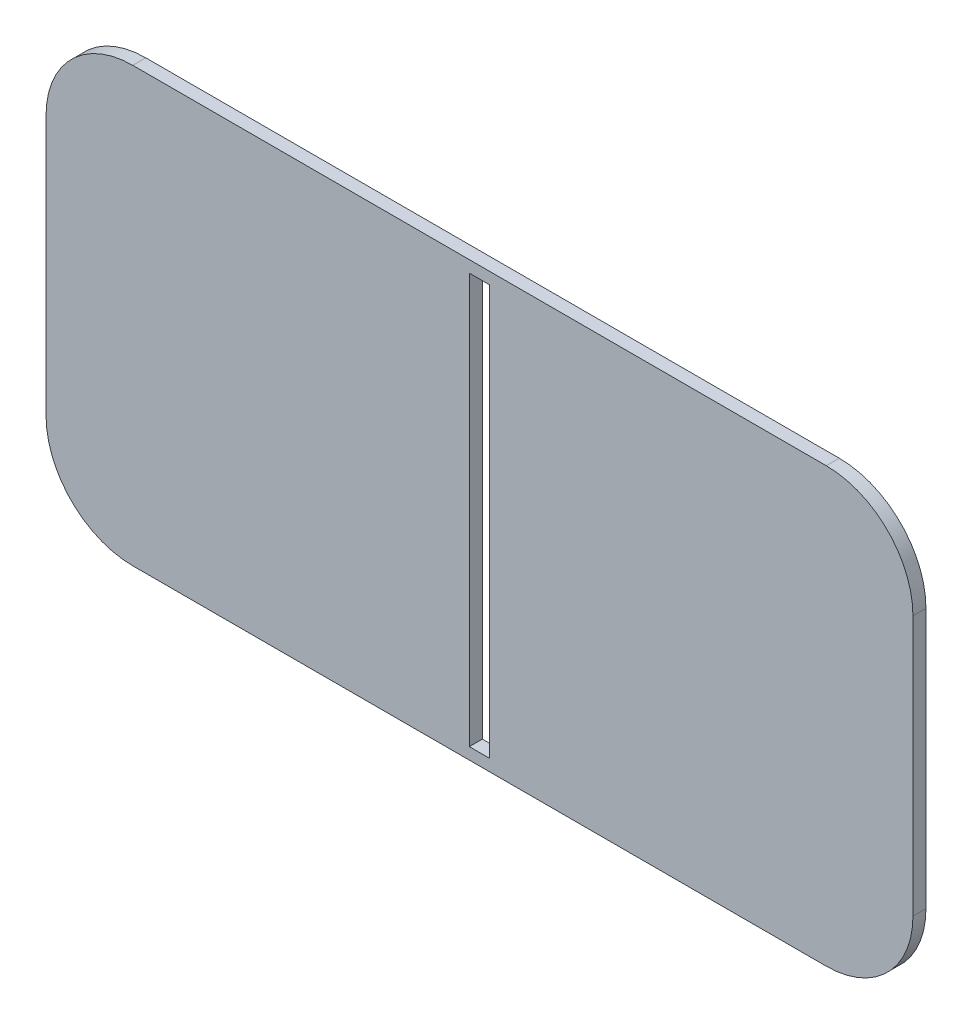
ISO-10303-21;
HEADER;
FILE_DESCRIPTION(('STEP AP214'),'2;1');
FILE_NAME('part.step','',(''),(''),'','','');
FILE_SCHEMA(('AUTOMOTIVE_DESIGN { 1 0 10303 214 1 1 1 1 }'));
ENDSEC;
DATA;
#1=APPLICATION_CONTEXT('core data for automotive mechanical design processes');
#2=APPLICATION_PROTOCOL_DEFINITION('international standard','automotive_design',2000,#1);
#3=PRODUCT_CONTEXT('',#1,'mechanical');
#4=PRODUCT('Part','Part','',(#3));
#5=PRODUCT_RELATED_PRODUCT_CATEGORY('part','',(#4));
#6=PRODUCT_DEFINITION_FORMATION('','',#4);
#7=PRODUCT_DEFINITION_CONTEXT('part definition',#1,'design');
#8=PRODUCT_DEFINITION('design','',#6,#7);
#9=PRODUCT_DEFINITION_SHAPE('','',#8);
#10=(LENGTH_UNIT() NAMED_UNIT(*) SI_UNIT(.MILLI.,.METRE.));
#11=(NAMED_UNIT(*) PLANE_ANGLE_UNIT() SI_UNIT($,.RADIAN.));
#12=(NAMED_UNIT(*) SI_UNIT($,.STERADIAN.) SOLID_ANGLE_UNIT());
#13=UNCERTAINTY_MEASURE_WITH_UNIT(LENGTH_MEASURE(1.E-05),#10,'distance_accuracy_value','');
#14=(GEOMETRIC_REPRESENTATION_CONTEXT(3) GLOBAL_UNCERTAINTY_ASSIGNED_CONTEXT((#13)) GLOBAL_UNIT_ASSIGNED_CONTEXT((#10,
#11,#12)) REPRESENTATION_CONTEXT('',''));
#15=CARTESIAN_POINT('',(0.,0.,0.));
#16=DIRECTION('',(0.,0.,1.));
#17=DIRECTION('',(1.,0.,0.));
#18=AXIS2_PLACEMENT_3D('',#15,#16,#17);
#19=CARTESIAN_POINT('',(98.5837081997804,0.,3.));
#20=DIRECTION('',(1.,0.,0.));
#21=DIRECTION('',(0.,0.,-1.));
#22=AXIS2_PLACEMENT_3D('',#19,#20,#21);
#23=PLANE('',#22);
#24=DIRECTION('',(0.,-1.,0.));
#25=VECTOR('',#24,1.);
#26=CARTESIAN_POINT('',(98.5837081997804,0.,0.));
#27=LINE('',#26,#25);
#28=CARTESIAN_POINT('',(98.5837081997804,-0.678529713852669,0.));
#29=VERTEX_POINT('',#28);
#30=CARTESIAN_POINT('',(98.5837081997804,-95.2819333125222,0.));
#31=VERTEX_POINT('',#30);
#32=EDGE_CURVE('E179',#29,#31,#27,.T.);
#33=ORIENTED_EDGE('',*,*,#32,.T.);
#34=DIRECTION('',(0.,0.,-1.));
#35=VECTOR('',#34,1.);
#36=CARTESIAN_POINT('',(98.5837081997804,-95.2819333125222,3.));
#37=LINE('',#36,#35);
#38=CARTESIAN_POINT('',(98.5837081997804,-95.2819333125222,3.));
#39=VERTEX_POINT('',#38);
#40=EDGE_CURVE('E11',#39,#31,#37,.T.);
#41=ORIENTED_EDGE('',*,*,#40,.F.);
#42=DIRECTION('',(0.,-1.,0.));
#43=VECTOR('',#42,1.);
#44=CARTESIAN_POINT('',(98.5837081997804,0.,3.));
#45=LINE('',#44,#43);
#46=CARTESIAN_POINT('',(98.5837081997804,-0.678529713852669,3.));
#47=VERTEX_POINT('',#46);
#48=EDGE_CURVE('E149',#47,#39,#45,.T.);
#49=ORIENTED_EDGE('',*,*,#48,.F.);
#50=DIRECTION('',(0.,0.,-1.));
#51=VECTOR('',#50,1.);
#52=CARTESIAN_POINT('',(98.5837081997804,-0.678529713852669,3.));
#53=LINE('',#52,#51);
#54=EDGE_CURVE('E187',#47,#29,#53,.T.);
#55=ORIENTED_EDGE('',*,*,#54,.T.);
#56=EDGE_LOOP('',(#33,#41,#49,#55));
#57=FACE_BOUND('',#56,.T.);
#58=ADVANCED_FACE('F39',(#57),#23,.F.);
#59=CARTESIAN_POINT('',(0.,-95.2819333125222,3.));
#60=DIRECTION('',(0.,1.,0.));
#61=DIRECTION('',(0.,0.,1.));
#62=AXIS2_PLACEMENT_3D('',#59,#60,#61);
#63=PLANE('',#62);
#64=DIRECTION('',(1.,0.,0.));
#65=VECTOR('',#64,1.);
#66=CARTESIAN_POINT('',(0.,-95.2819333125222,0.));
#67=LINE('',#66,#65);
#68=CARTESIAN_POINT('',(93.8855707750158,-95.2819333125222,0.));
#69=VERTEX_POINT('',#68);
#70=EDGE_CURVE('E140',#69,#31,#67,.T.);
#71=ORIENTED_EDGE('',*,*,#70,.F.);
#72=DIRECTION('',(0.,0.,-1.));
#73=VECTOR('',#72,1.);
#74=CARTESIAN_POINT('',(93.8855707750158,-95.2819333125222,3.));
#75=LINE('',#74,#73);
#76=CARTESIAN_POINT('',(93.8855707750158,-95.2819333125222,3.));
#77=VERTEX_POINT('',#76);
#78=EDGE_CURVE('E49',#77,#69,#75,.T.);
#79=ORIENTED_EDGE('',*,*,#78,.F.);
#80=DIRECTION('',(1.,0.,0.));
#81=VECTOR('',#80,1.);
#82=CARTESIAN_POINT('',(0.,-95.2819333125222,3.));
#83=LINE('',#82,#81);
#84=EDGE_CURVE('E138',#77,#39,#83,.T.);
#85=ORIENTED_EDGE('',*,*,#84,.T.);
#86=ORIENTED_EDGE('',*,*,#40,.T.);
#87=EDGE_LOOP('',(#71,#79,#85,#86));
#88=FACE_BOUND('',#87,.T.);
#89=ADVANCED_FACE('F137',(#88),#63,.T.);
#90=CARTESIAN_POINT('',(93.8855707750158,0.,3.));
#91=DIRECTION('',(1.,0.,0.));
#92=DIRECTION('',(0.,0.,-1.));
#93=AXIS2_PLACEMENT_3D('',#90,#91,#92);
#94=PLANE('',#93);
#95=DIRECTION('',(0.,-1.,0.));
#96=VECTOR('',#95,1.);
#97=CARTESIAN_POINT('',(93.8855707750158,0.,0.));
#98=LINE('',#97,#96);
#99=CARTESIAN_POINT('',(93.8855707750158,-0.678529713852669,0.));
#100=VERTEX_POINT('',#99);
#101=EDGE_CURVE('E183',#100,#69,#98,.T.);
#102=ORIENTED_EDGE('',*,*,#101,.F.);
#103=DIRECTION('',(0.,0.,-1.));
#104=VECTOR('',#103,1.);
#105=CARTESIAN_POINT('',(93.8855707750158,-0.678529713852669,3.));
#106=LINE('',#105,#104);
#107=CARTESIAN_POINT('',(93.8855707750158,-0.678529713852669,3.));
#108=VERTEX_POINT('',#107);
#109=EDGE_CURVE('E97',#108,#100,#106,.T.);
#110=ORIENTED_EDGE('',*,*,#109,.F.);
#111=DIRECTION('',(0.,-1.,0.));
#112=VECTOR('',#111,1.);
#113=CARTESIAN_POINT('',(93.8855707750158,0.,3.));
#114=LINE('',#113,#112);
#115=EDGE_CURVE('E147',#108,#77,#114,.T.);
#116=ORIENTED_EDGE('',*,*,#115,.T.);
#117=ORIENTED_EDGE('',*,*,#78,.T.);
#118=EDGE_LOOP('',(#102,#110,#116,#117));
#119=FACE_BOUND('',#118,.T.);
#120=ADVANCED_FACE('F152',(#119),#94,.T.);
#121=CARTESIAN_POINT('',(0.,-97.9802315131874,3.));
#122=DIRECTION('',(0.,1.,0.));
#123=DIRECTION('',(0.,0.,1.));
#124=AXIS2_PLACEMENT_3D('',#121,#122,#123);
#125=PLANE('',#124);
#126=DIRECTION('',(1.,0.,0.));
#127=VECTOR('',#126,1.);
#128=CARTESIAN_POINT('',(0.,-97.9802315131874,0.));
#129=LINE('',#128,#127);
#130=CARTESIAN_POINT('',(16.2346394873982,-97.9802315131874,0.));
#131=VERTEX_POINT('',#130);
#132=CARTESIAN_POINT('',(176.234639487398,-97.9802315131874,0.));
#133=VERTEX_POINT('',#132);
#134=EDGE_CURVE('E158',#131,#133,#129,.T.);
#135=ORIENTED_EDGE('',*,*,#134,.T.);
#136=DIRECTION('',(0.,0.,-1.));
#137=VECTOR('',#136,1.);
#138=CARTESIAN_POINT('',(176.234639487398,-97.9802315131874,3.));
#139=LINE('',#138,#137);
#140=CARTESIAN_POINT('',(176.234639487398,-97.9802315131874,3.));
#141=VERTEX_POINT('',#140);
#142=EDGE_CURVE('E43',#141,#133,#139,.T.);
#143=ORIENTED_EDGE('',*,*,#142,.F.);
#144=DIRECTION('',(1.,0.,0.));
#145=VECTOR('',#144,1.);
#146=CARTESIAN_POINT('',(0.,-97.9802315131874,3.));
#147=LINE('',#146,#145);
#148=CARTESIAN_POINT('',(16.2346394873982,-97.9802315131874,3.));
#149=VERTEX_POINT('',#148);
#150=EDGE_CURVE('E186',#149,#141,#147,.T.);
#151=ORIENTED_EDGE('',*,*,#150,.F.);
#152=DIRECTION('',(0.,0.,-1.));
#153=VECTOR('',#152,1.);
#154=CARTESIAN_POINT('',(16.2346394873982,-97.9802315131874,3.));
#155=LINE('',#154,#153);
#156=EDGE_CURVE('E154',#149,#131,#155,.T.);
#157=ORIENTED_EDGE('',*,*,#156,.T.);
#158=EDGE_LOOP('',(#135,#143,#151,#157));
#159=FACE_BOUND('',#158,.T.);
#160=ADVANCED_FACE('F41',(#159),#125,.F.);
#161=CARTESIAN_POINT('',(176.234639487398,-77.9802315131874,3.));
#162=DIRECTION('',(0.,0.,-1.));
#163=DIRECTION('',(-1.,0.,0.));
#164=AXIS2_PLACEMENT_3D('',#161,#162,#163);
#165=CYLINDRICAL_SURFACE('',#164,20.);
#166=CARTESIAN_POINT('',(176.234639487398,-77.9802315131874,0.));
#167=DIRECTION('',(0.,0.,1.));
#168=DIRECTION('',(1.,0.,0.));
#169=AXIS2_PLACEMENT_3D('',#166,#167,#168);
#170=CIRCLE('',#169,20.);
#171=CARTESIAN_POINT('',(196.234639487398,-77.9802315131873,0.));
#172=VERTEX_POINT('',#171);
#173=EDGE_CURVE('E161',#133,#172,#170,.T.);
#174=ORIENTED_EDGE('',*,*,#173,.T.);
#175=DIRECTION('',(0.,0.,-1.));
#176=VECTOR('',#175,1.);
#177=CARTESIAN_POINT('',(196.234639487398,-77.9802315131873,3.));
#178=LINE('',#177,#176);
#179=CARTESIAN_POINT('',(196.234639487398,-77.9802315131873,3.));
#180=VERTEX_POINT('',#179);
#181=EDGE_CURVE('E203',#180,#172,#178,.T.);
#182=ORIENTED_EDGE('',*,*,#181,.F.);
#183=CARTESIAN_POINT('',(176.234639487398,-77.9802315131874,3.));
#184=DIRECTION('',(0.,0.,1.));
#185=DIRECTION('',(1.,0.,0.));
#186=AXIS2_PLACEMENT_3D('',#183,#184,#185);
#187=CIRCLE('',#186,20.);
#188=EDGE_CURVE('E109',#141,#180,#187,.T.);
#189=ORIENTED_EDGE('',*,*,#188,.F.);
#190=ORIENTED_EDGE('',*,*,#142,.T.);
#191=EDGE_LOOP('',(#174,#182,#189,#190));
#192=FACE_BOUND('',#191,.T.);
#193=ADVANCED_FACE('F208',(#192),#165,.T.);
#194=CARTESIAN_POINT('',(196.234639487398,0.,3.));
#195=DIRECTION('',(1.,0.,0.));
#196=DIRECTION('',(0.,0.,-1.));
#197=AXIS2_PLACEMENT_3D('',#194,#195,#196);
#198=PLANE('',#197);
#199=DIRECTION('',(0.,-1.,0.));
#200=VECTOR('',#199,1.);
#201=CARTESIAN_POINT('',(196.234639487398,0.,0.));
#202=LINE('',#201,#200);
#203=CARTESIAN_POINT('',(196.234639487398,-17.9802315131876,0.));
#204=VERTEX_POINT('',#203);
#205=EDGE_CURVE('E164',#204,#172,#202,.T.);
#206=ORIENTED_EDGE('',*,*,#205,.F.);
#207=DIRECTION('',(0.,0.,-1.));
#208=VECTOR('',#207,1.);
#209=CARTESIAN_POINT('',(196.234639487398,-17.9802315131876,3.));
#210=LINE('',#209,#208);
#211=CARTESIAN_POINT('',(196.234639487398,-17.9802315131876,3.));
#212=VERTEX_POINT('',#211);
#213=EDGE_CURVE('E202',#212,#204,#210,.T.);
#214=ORIENTED_EDGE('',*,*,#213,.F.);
#215=DIRECTION('',(0.,-1.,0.));
#216=VECTOR('',#215,1.);
#217=CARTESIAN_POINT('',(196.234639487398,0.,3.));
#218=LINE('',#217,#216);
#219=EDGE_CURVE('E221',#212,#180,#218,.T.);
#220=ORIENTED_EDGE('',*,*,#219,.T.);
#221=ORIENTED_EDGE('',*,*,#181,.T.);
#222=EDGE_LOOP('',(#206,#214,#220,#221));
#223=FACE_BOUND('',#222,.T.);
#224=ADVANCED_FACE('F219',(#223),#198,.T.);
#225=CARTESIAN_POINT('',(176.234639487398,-17.9802315131874,3.));
#226=DIRECTION('',(0.,0.,-1.));
#227=DIRECTION('',(-1.,0.,0.));
#228=AXIS2_PLACEMENT_3D('',#225,#226,#227);
#229=CYLINDRICAL_SURFACE('',#228,20.);
#230=CARTESIAN_POINT('',(176.234639487398,-17.9802315131874,0.));
#231=DIRECTION('',(0.,0.,1.));
#232=DIRECTION('',(1.,0.,0.));
#233=AXIS2_PLACEMENT_3D('',#230,#231,#232);
#234=CIRCLE('',#233,20.);
#235=CARTESIAN_POINT('',(176.234639487398,2.01976848681256,0.));
#236=VERTEX_POINT('',#235);
#237=EDGE_CURVE('E167',#236,#204,#234,.F.);
#238=ORIENTED_EDGE('',*,*,#237,.F.);
#239=DIRECTION('',(0.,0.,-1.));
#240=VECTOR('',#239,1.);
#241=CARTESIAN_POINT('',(176.234639487398,2.01976848681256,3.));
#242=LINE('',#241,#240);
#243=CARTESIAN_POINT('',(176.234639487398,2.01976848681256,3.));
#244=VERTEX_POINT('',#243);
#245=EDGE_CURVE('E200',#244,#236,#242,.T.);
#246=ORIENTED_EDGE('',*,*,#245,.F.);
#247=CARTESIAN_POINT('',(176.234639487398,-17.9802315131874,3.));
#248=DIRECTION('',(0.,0.,1.));
#249=DIRECTION('',(1.,0.,0.));
#250=AXIS2_PLACEMENT_3D('',#247,#248,#249);
#251=CIRCLE('',#250,20.);
#252=EDGE_CURVE('E227',#244,#212,#251,.F.);
#253=ORIENTED_EDGE('',*,*,#252,.T.);
#254=ORIENTED_EDGE('',*,*,#213,.T.);
#255=EDGE_LOOP('',(#238,#246,#253,#254));
#256=FACE_BOUND('',#255,.T.);
#257=ADVANCED_FACE('F230',(#256),#229,.T.);
#258=CARTESIAN_POINT('',(0.,2.01976848681256,3.));
#259=DIRECTION('',(0.,1.,0.));
#260=DIRECTION('',(0.,0.,1.));
#261=AXIS2_PLACEMENT_3D('',#258,#259,#260);
#262=PLANE('',#261);
#263=DIRECTION('',(1.,0.,0.));
#264=VECTOR('',#263,1.);
#265=CARTESIAN_POINT('',(0.,2.01976848681256,0.));
#266=LINE('',#265,#264);
#267=CARTESIAN_POINT('',(16.2346394873982,2.01976848681256,0.));
#268=VERTEX_POINT('',#267);
#269=EDGE_CURVE('E170',#268,#236,#266,.T.);
#270=ORIENTED_EDGE('',*,*,#269,.F.);
#271=DIRECTION('',(0.,0.,-1.));
#272=VECTOR('',#271,1.);
#273=CARTESIAN_POINT('',(16.2346394873982,2.01976848681256,3.));
#274=LINE('',#273,#272);
#275=CARTESIAN_POINT('',(16.2346394873982,2.01976848681256,3.));
#276=VERTEX_POINT('',#275);
#277=EDGE_CURVE('E198',#276,#268,#274,.T.);
#278=ORIENTED_EDGE('',*,*,#277,.F.);
#279=DIRECTION('',(1.,0.,0.));
#280=VECTOR('',#279,1.);
#281=CARTESIAN_POINT('',(0.,2.01976848681256,3.));
#282=LINE('',#281,#280);
#283=EDGE_CURVE('E231',#276,#244,#282,.T.);
#284=ORIENTED_EDGE('',*,*,#283,.T.);
#285=ORIENTED_EDGE('',*,*,#245,.T.);
#286=EDGE_LOOP('',(#270,#278,#284,#285));
#287=FACE_BOUND('',#286,.T.);
#288=ADVANCED_FACE('F254',(#287),#262,.T.);
#289=CARTESIAN_POINT('',(16.2346394873981,-17.9802315131874,3.));
#290=DIRECTION('',(0.,0.,-1.));
#291=DIRECTION('',(-1.,0.,0.));
#292=AXIS2_PLACEMENT_3D('',#289,#290,#291);
#293=CYLINDRICAL_SURFACE('',#292,20.);
#294=CARTESIAN_POINT('',(16.2346394873981,-17.9802315131874,0.));
#295=DIRECTION('',(0.,0.,1.));
#296=DIRECTION('',(1.,0.,0.));
#297=AXIS2_PLACEMENT_3D('',#294,#295,#296);
#298=CIRCLE('',#297,20.);
#299=CARTESIAN_POINT('',(-3.76536051260192,-17.9802315131876,0.));
#300=VERTEX_POINT('',#299);
#301=EDGE_CURVE('E173',#268,#300,#298,.T.);
#302=ORIENTED_EDGE('',*,*,#301,.T.);
#303=DIRECTION('',(0.,0.,-1.));
#304=VECTOR('',#303,1.);
#305=CARTESIAN_POINT('',(-3.76536051260192,-17.9802315131876,3.));
#306=LINE('',#305,#304);
#307=CARTESIAN_POINT('',(-3.76536051260192,-17.9802315131876,3.));
#308=VERTEX_POINT('',#307);
#309=EDGE_CURVE('E195',#308,#300,#306,.T.);
#310=ORIENTED_EDGE('',*,*,#309,.F.);
#311=CARTESIAN_POINT('',(16.2346394873981,-17.9802315131874,3.));
#312=DIRECTION('',(0.,0.,1.));
#313=DIRECTION('',(1.,0.,0.));
#314=AXIS2_PLACEMENT_3D('',#311,#312,#313);
#315=CIRCLE('',#314,20.);
#316=EDGE_CURVE('E233',#276,#308,#315,.T.);
#317=ORIENTED_EDGE('',*,*,#316,.F.);
#318=ORIENTED_EDGE('',*,*,#277,.T.);
#319=EDGE_LOOP('',(#302,#310,#317,#318));
#320=FACE_BOUND('',#319,.T.);
#321=ADVANCED_FACE('F256',(#320),#293,.T.);
#322=CARTESIAN_POINT('',(-3.76536051260192,0.,3.));
#323=DIRECTION('',(1.,0.,0.));
#324=DIRECTION('',(0.,1.,0.));
#325=AXIS2_PLACEMENT_3D('',#322,#323,#324);
#326=PLANE('',#325);
#327=DIRECTION('',(0.,-1.,0.));
#328=VECTOR('',#327,1.);
#329=CARTESIAN_POINT('',(-3.76536051260192,0.,0.));
#330=LINE('',#329,#328);
#331=CARTESIAN_POINT('',(-3.76536051260192,-77.9802315131873,0.));
#332=VERTEX_POINT('',#331);
#333=EDGE_CURVE('E175',#300,#332,#330,.T.);
#334=ORIENTED_EDGE('',*,*,#333,.T.);
#335=DIRECTION('',(0.,0.,-1.));
#336=VECTOR('',#335,1.);
#337=CARTESIAN_POINT('',(-3.76536051260192,-77.9802315131873,3.));
#338=LINE('',#337,#336);
#339=CARTESIAN_POINT('',(-3.76536051260192,-77.9802315131873,3.));
#340=VERTEX_POINT('',#339);
#341=EDGE_CURVE('E192',#340,#332,#338,.T.);
#342=ORIENTED_EDGE('',*,*,#341,.F.);
#343=DIRECTION('',(0.,-1.,0.));
#344=VECTOR('',#343,1.);
#345=CARTESIAN_POINT('',(-3.76536051260192,0.,3.));
#346=LINE('',#345,#344);
#347=EDGE_CURVE('E238',#308,#340,#346,.T.);
#348=ORIENTED_EDGE('',*,*,#347,.F.);
#349=ORIENTED_EDGE('',*,*,#309,.T.);
#350=EDGE_LOOP('',(#334,#342,#348,#349));
#351=FACE_BOUND('',#350,.T.);
#352=ADVANCED_FACE('F248',(#351),#326,.F.);
#353=CARTESIAN_POINT('',(16.2346394873981,-77.9802315131874,3.));
#354=DIRECTION('',(0.,0.,-1.));
#355=DIRECTION('',(-1.,0.,0.));
#356=AXIS2_PLACEMENT_3D('',#353,#354,#355);
#357=CYLINDRICAL_SURFACE('',#356,20.);
#358=CARTESIAN_POINT('',(16.2346394873981,-77.9802315131874,0.));
#359=DIRECTION('',(0.,0.,1.));
#360=DIRECTION('',(1.,0.,0.));
#361=AXIS2_PLACEMENT_3D('',#358,#359,#360);
#362=CIRCLE('',#361,20.);
#363=EDGE_CURVE('E177',#332,#131,#362,.T.);
#364=ORIENTED_EDGE('',*,*,#363,.T.);
#365=ORIENTED_EDGE('',*,*,#156,.F.);
#366=CARTESIAN_POINT('',(16.2346394873981,-77.9802315131874,3.));
#367=DIRECTION('',(0.,0.,1.));
#368=DIRECTION('',(1.,0.,0.));
#369=AXIS2_PLACEMENT_3D('',#366,#367,#368);
#370=CIRCLE('',#369,20.);
#371=EDGE_CURVE('E240',#340,#149,#370,.T.);
#372=ORIENTED_EDGE('',*,*,#371,.F.);
#373=ORIENTED_EDGE('',*,*,#341,.T.);
#374=EDGE_LOOP('',(#364,#365,#372,#373));
#375=FACE_BOUND('',#374,.T.);
#376=ADVANCED_FACE('F245',(#375),#357,.T.);
#377=CARTESIAN_POINT('',(0.,-0.678529713852669,3.));
#378=DIRECTION('',(0.,1.,0.));
#379=DIRECTION('',(0.,0.,1.));
#380=AXIS2_PLACEMENT_3D('',#377,#378,#379);
#381=PLANE('',#380);
#382=DIRECTION('',(1.,0.,0.));
#383=VECTOR('',#382,1.);
#384=CARTESIAN_POINT('',(0.,-0.678529713852669,0.));
#385=LINE('',#384,#383);
#386=EDGE_CURVE('E100',#100,#29,#385,.T.);
#387=ORIENTED_EDGE('',*,*,#386,.T.);
#388=ORIENTED_EDGE('',*,*,#54,.F.);
#389=DIRECTION('',(1.,0.,0.));
#390=VECTOR('',#389,1.);
#391=CARTESIAN_POINT('',(0.,-0.678529713852669,3.));
#392=LINE('',#391,#390);
#393=EDGE_CURVE('E58',#108,#47,#392,.T.);
#394=ORIENTED_EDGE('',*,*,#393,.F.);
#395=ORIENTED_EDGE('',*,*,#109,.T.);
#396=EDGE_LOOP('',(#387,#388,#394,#395));
#397=FACE_BOUND('',#396,.T.);
#398=ADVANCED_FACE('F275',(#397),#381,.F.);
#399=CARTESIAN_POINT('',(0.,0.,3.));
#400=DIRECTION('',(0.,0.,1.));
#401=DIRECTION('',(1.,0.,0.));
#402=AXIS2_PLACEMENT_3D('',#399,#400,#401);
#403=PLANE('',#402);
#404=ORIENTED_EDGE('',*,*,#150,.T.);
#405=ORIENTED_EDGE('',*,*,#188,.T.);
#406=ORIENTED_EDGE('',*,*,#219,.F.);
#407=ORIENTED_EDGE('',*,*,#252,.F.);
#408=ORIENTED_EDGE('',*,*,#283,.F.);
#409=ORIENTED_EDGE('',*,*,#316,.T.);
#410=ORIENTED_EDGE('',*,*,#347,.T.);
#411=ORIENTED_EDGE('',*,*,#371,.T.);
#412=EDGE_LOOP('',(#404,#405,#406,#407,#408,#409,#410,#411));
#413=FACE_BOUND('',#412,.T.);
#414=ORIENTED_EDGE('',*,*,#48,.T.);
#415=ORIENTED_EDGE('',*,*,#84,.F.);
#416=ORIENTED_EDGE('',*,*,#115,.F.);
#417=ORIENTED_EDGE('',*,*,#393,.T.);
#418=EDGE_LOOP('',(#414,#415,#416,#417));
#419=FACE_BOUND('',#418,.T.);
#420=ADVANCED_FACE('F146',(#413,#419),#403,.T.);
#421=CARTESIAN_POINT('',(0.,0.,0.));
#422=DIRECTION('',(0.,0.,1.));
#423=DIRECTION('',(1.,0.,0.));
#424=AXIS2_PLACEMENT_3D('',#421,#422,#423);
#425=PLANE('',#424);
#426=ORIENTED_EDGE('',*,*,#134,.F.);
#427=ORIENTED_EDGE('',*,*,#363,.F.);
#428=ORIENTED_EDGE('',*,*,#333,.F.);
#429=ORIENTED_EDGE('',*,*,#301,.F.);
#430=ORIENTED_EDGE('',*,*,#269,.T.);
#431=ORIENTED_EDGE('',*,*,#237,.T.);
#432=ORIENTED_EDGE('',*,*,#205,.T.);
#433=ORIENTED_EDGE('',*,*,#173,.F.);
#434=EDGE_LOOP('',(#426,#427,#428,#429,#430,#431,#432,#433));
#435=FACE_BOUND('',#434,.T.);
#436=ORIENTED_EDGE('',*,*,#32,.F.);
#437=ORIENTED_EDGE('',*,*,#386,.F.);
#438=ORIENTED_EDGE('',*,*,#101,.T.);
#439=ORIENTED_EDGE('',*,*,#70,.T.);
#440=EDGE_LOOP('',(#436,#437,#438,#439));
#441=FACE_BOUND('',#440,.T.);
#442=ADVANCED_FACE('F215',(#435,#441),#425,.F.);
#443=CLOSED_SHELL('',(#58,#89,#120,#160,#193,#224,#257,#288,#321,#352,#376,#398,#420,#442));
#444=MANIFOLD_SOLID_BREP('B2',#443);
#445=ADVANCED_BREP_SHAPE_REPRESENTATION('',(#18,#444),#14);
#446=SHAPE_DEFINITION_REPRESENTATION(#9,#445);
ENDSEC;
END-ISO-10303-21;
